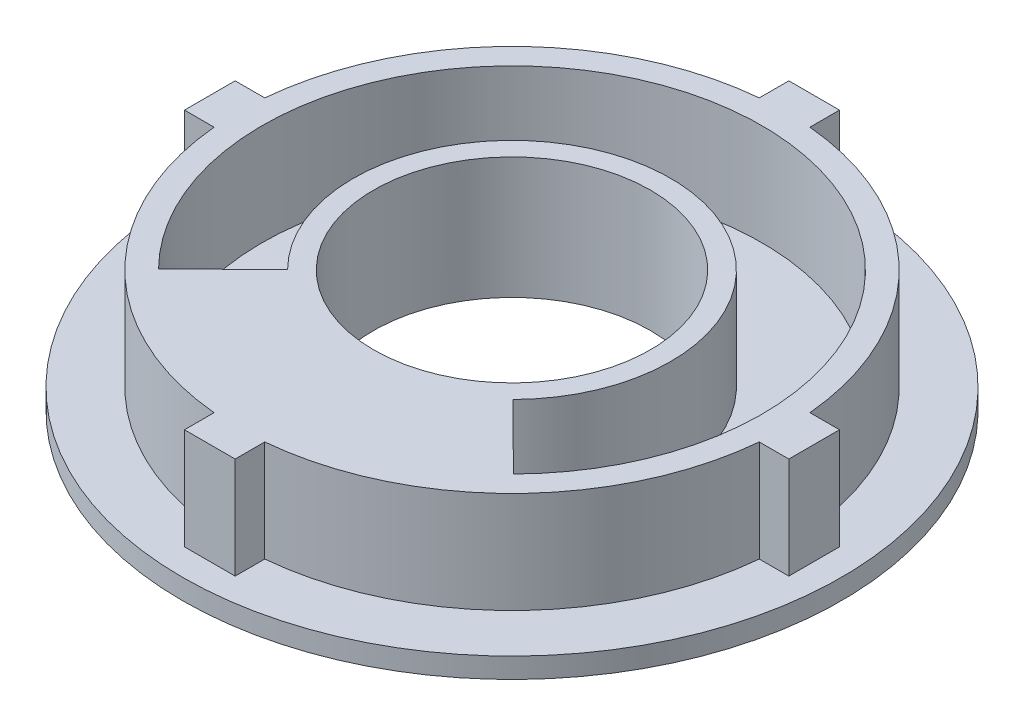
ISO-10303-21;
HEADER;
FILE_DESCRIPTION(('STEP AP214'),'2;1');
FILE_NAME('part.step','',(''),(''),'','','');
FILE_SCHEMA(('AUTOMOTIVE_DESIGN { 1 0 10303 214 1 1 1 1 }'));
ENDSEC;
DATA;
#1=APPLICATION_CONTEXT('core data for automotive mechanical design processes');
#2=APPLICATION_PROTOCOL_DEFINITION('international standard','automotive_design',2000,#1);
#3=PRODUCT_CONTEXT('',#1,'mechanical');
#4=PRODUCT('Part','Part','',(#3));
#5=PRODUCT_RELATED_PRODUCT_CATEGORY('part','',(#4));
#6=PRODUCT_DEFINITION_FORMATION('','',#4);
#7=PRODUCT_DEFINITION_CONTEXT('part definition',#1,'design');
#8=PRODUCT_DEFINITION('design','',#6,#7);
#9=PRODUCT_DEFINITION_SHAPE('','',#8);
#10=(LENGTH_UNIT() NAMED_UNIT(*) SI_UNIT(.MILLI.,.METRE.));
#11=(NAMED_UNIT(*) PLANE_ANGLE_UNIT() SI_UNIT($,.RADIAN.));
#12=(NAMED_UNIT(*) SI_UNIT($,.STERADIAN.) SOLID_ANGLE_UNIT());
#13=UNCERTAINTY_MEASURE_WITH_UNIT(LENGTH_MEASURE(1.E-05),#10,'distance_accuracy_value','');
#14=(GEOMETRIC_REPRESENTATION_CONTEXT(3) GLOBAL_UNCERTAINTY_ASSIGNED_CONTEXT((#13)) GLOBAL_UNIT_ASSIGNED_CONTEXT((#10,
#11,#12)) REPRESENTATION_CONTEXT('',''));
#15=CARTESIAN_POINT('',(0.,0.,0.));
#16=DIRECTION('',(0.,0.,1.));
#17=DIRECTION('',(1.,0.,0.));
#18=AXIS2_PLACEMENT_3D('',#15,#16,#17);
#19=CARTESIAN_POINT('',(0.,10.,0.));
#20=DIRECTION('',(0.,-1.,0.));
#21=DIRECTION('',(0.,0.,-1.));
#22=AXIS2_PLACEMENT_3D('',#19,#20,#21);
#23=CYLINDRICAL_SURFACE('',#22,27.);
#24=DIRECTION('',(0.,-1.,0.));
#25=VECTOR('',#24,1.);
#26=CARTESIAN_POINT('',(-26.8840101175404,10.,-2.49999999999735));
#27=LINE('',#26,#25);
#28=CARTESIAN_POINT('',(-26.8840101175404,10.,-2.49999999999735));
#29=VERTEX_POINT('',#28);
#30=CARTESIAN_POINT('',(-26.8840101175404,0.,-2.49999999999735));
#31=VERTEX_POINT('',#30);
#32=EDGE_CURVE('E216',#29,#31,#27,.T.);
#33=ORIENTED_EDGE('',*,*,#32,.F.);
#34=CARTESIAN_POINT('',(0.,10.,0.));
#35=DIRECTION('',(0.,1.,0.));
#36=DIRECTION('',(0.,0.,1.));
#37=AXIS2_PLACEMENT_3D('',#34,#35,#36);
#38=CIRCLE('',#37,27.);
#39=CARTESIAN_POINT('',(-2.5,10.,-26.8840101175401));
#40=VERTEX_POINT('',#39);
#41=EDGE_CURVE('E47',#40,#29,#38,.T.);
#42=ORIENTED_EDGE('',*,*,#41,.F.);
#43=DIRECTION('',(0.,-1.,0.));
#44=VECTOR('',#43,1.);
#45=CARTESIAN_POINT('',(-2.5,10.,-26.8840101175401));
#46=LINE('',#45,#44);
#47=CARTESIAN_POINT('',(-2.5,0.,-26.8840101175401));
#48=VERTEX_POINT('',#47);
#49=EDGE_CURVE('E320',#48,#40,#46,.F.);
#50=ORIENTED_EDGE('',*,*,#49,.F.);
#51=CARTESIAN_POINT('',(0.,0.,0.));
#52=DIRECTION('',(0.,1.,0.));
#53=DIRECTION('',(0.,0.,1.));
#54=AXIS2_PLACEMENT_3D('',#51,#52,#53);
#55=CIRCLE('',#54,27.);
#56=EDGE_CURVE('E361',#48,#31,#55,.T.);
#57=ORIENTED_EDGE('',*,*,#56,.T.);
#58=EDGE_LOOP('',(#33,#42,#50,#57));
#59=FACE_BOUND('',#58,.T.);
#60=ADVANCED_FACE('F39',(#59),#23,.T.);
#61=DIRECTION('',(0.,-1.,0.));
#62=VECTOR('',#61,1.);
#63=CARTESIAN_POINT('',(-26.8840101175399,10.,2.50000000000265));
#64=LINE('',#63,#62);
#65=CARTESIAN_POINT('',(-26.8840101175399,0.,2.50000000000265));
#66=VERTEX_POINT('',#65);
#67=CARTESIAN_POINT('',(-26.8840101175399,10.,2.50000000000265));
#68=VERTEX_POINT('',#67);
#69=EDGE_CURVE('E193',#66,#68,#64,.F.);
#70=ORIENTED_EDGE('',*,*,#69,.F.);
#71=CARTESIAN_POINT('',(-2.49999999999417,0.,26.8840101175407));
#72=VERTEX_POINT('',#71);
#73=EDGE_CURVE('E393',#66,#72,#55,.T.);
#74=ORIENTED_EDGE('',*,*,#73,.T.);
#75=DIRECTION('',(0.,-1.,0.));
#76=VECTOR('',#75,1.);
#77=CARTESIAN_POINT('',(-2.49999999999417,10.,26.8840101175407));
#78=LINE('',#77,#76);
#79=CARTESIAN_POINT('',(-2.49999999999417,10.,26.8840101175407));
#80=VERTEX_POINT('',#79);
#81=EDGE_CURVE('E253',#80,#72,#78,.T.);
#82=ORIENTED_EDGE('',*,*,#81,.F.);
#83=EDGE_CURVE('E390',#68,#80,#38,.T.);
#84=ORIENTED_EDGE('',*,*,#83,.F.);
#85=EDGE_LOOP('',(#70,#74,#82,#84));
#86=FACE_BOUND('',#85,.T.);
#87=ADVANCED_FACE('F435',(#86),#23,.T.);
#88=CARTESIAN_POINT('',(0.,0.,0.));
#89=DIRECTION('',(0.,-1.,0.));
#90=DIRECTION('',(0.,0.,-1.));
#91=AXIS2_PLACEMENT_3D('',#88,#89,#90);
#92=PLANE('',#91);
#93=CARTESIAN_POINT('',(0.,0.,0.));
#94=DIRECTION('',(0.,-1.,0.));
#95=DIRECTION('',(0.,0.,-1.));
#96=AXIS2_PLACEMENT_3D('',#93,#94,#95);
#97=CIRCLE('',#96,32.5);
#98=CARTESIAN_POINT('',(0.,0.,-32.5));
#99=VERTEX_POINT('',#98);
#100=EDGE_CURVE('E332',#99,#99,#97,.T.);
#101=ORIENTED_EDGE('',*,*,#100,.F.);
#102=EDGE_LOOP('',(#101));
#103=FACE_BOUND('',#102,.T.);
#104=DIRECTION('',(-1.,0.,0.));
#105=VECTOR('',#104,1.);
#106=CARTESIAN_POINT('',(-29.7999999999968,0.,-2.49999999999735));
#107=LINE('',#106,#105);
#108=CARTESIAN_POINT('',(-29.7999999999968,0.,-2.49999999999735));
#109=VERTEX_POINT('',#108);
#110=EDGE_CURVE('E190',#31,#109,#107,.T.);
#111=ORIENTED_EDGE('',*,*,#110,.F.);
#112=ORIENTED_EDGE('',*,*,#56,.F.);
#113=DIRECTION('',(0.,0.,1.));
#114=VECTOR('',#113,1.);
#115=CARTESIAN_POINT('',(-2.5,0.,-29.8));
#116=LINE('',#115,#114);
#117=CARTESIAN_POINT('',(-2.5,0.,-29.8));
#118=VERTEX_POINT('',#117);
#119=EDGE_CURVE('E300',#118,#48,#116,.T.);
#120=ORIENTED_EDGE('',*,*,#119,.F.);
#121=DIRECTION('',(-1.,0.,0.));
#122=VECTOR('',#121,1.);
#123=CARTESIAN_POINT('',(-2.5,0.,-29.8));
#124=LINE('',#123,#122);
#125=CARTESIAN_POINT('',(2.5,0.,-29.8));
#126=VERTEX_POINT('',#125);
#127=EDGE_CURVE('E295',#126,#118,#124,.T.);
#128=ORIENTED_EDGE('',*,*,#127,.F.);
#129=DIRECTION('',(0.,0.,-1.));
#130=VECTOR('',#129,1.);
#131=CARTESIAN_POINT('',(2.5,0.,0.));
#132=LINE('',#131,#130);
#133=CARTESIAN_POINT('',(2.5,0.,-26.8840101175401));
#134=VERTEX_POINT('',#133);
#135=EDGE_CURVE('E11',#134,#126,#132,.T.);
#136=ORIENTED_EDGE('',*,*,#135,.F.);
#137=CARTESIAN_POINT('',(26.8840101175398,0.,-2.50000000000318));
#138=VERTEX_POINT('',#137);
#139=EDGE_CURVE('E337',#138,#134,#55,.T.);
#140=ORIENTED_EDGE('',*,*,#139,.F.);
#141=DIRECTION('',(-1.,0.,0.));
#142=VECTOR('',#141,1.);
#143=CARTESIAN_POINT('',(29.8000000000026,0.,-2.50000000000318));
#144=LINE('',#143,#142);
#145=CARTESIAN_POINT('',(29.8000000000026,0.,-2.50000000000318));
#146=VERTEX_POINT('',#145);
#147=EDGE_CURVE('E262',#146,#138,#144,.T.);
#148=ORIENTED_EDGE('',*,*,#147,.F.);
#149=DIRECTION('',(0.,0.,-1.));
#150=VECTOR('',#149,1.);
#151=CARTESIAN_POINT('',(29.8000000000026,0.,-2.50000000000318));
#152=LINE('',#151,#150);
#153=CARTESIAN_POINT('',(29.8000000000026,0.,2.49999999999682));
#154=VERTEX_POINT('',#153);
#155=EDGE_CURVE('E273',#154,#146,#152,.T.);
#156=ORIENTED_EDGE('',*,*,#155,.F.);
#157=DIRECTION('',(1.,0.,0.));
#158=VECTOR('',#157,1.);
#159=CARTESIAN_POINT('',(29.8000000000026,0.,2.49999999999682));
#160=LINE('',#159,#158);
#161=CARTESIAN_POINT('',(26.8840101175404,0.,2.49999999999682));
#162=VERTEX_POINT('',#161);
#163=EDGE_CURVE('E257',#162,#154,#160,.T.);
#164=ORIENTED_EDGE('',*,*,#163,.F.);
#165=CARTESIAN_POINT('',(2.50000000000583,0.,26.8840101175396));
#166=VERTEX_POINT('',#165);
#167=EDGE_CURVE('E397',#166,#162,#55,.T.);
#168=ORIENTED_EDGE('',*,*,#167,.F.);
#169=DIRECTION('',(0.,0.,-1.));
#170=VECTOR('',#169,1.);
#171=CARTESIAN_POINT('',(2.50000000000583,0.,29.7999999999995));
#172=LINE('',#171,#170);
#173=CARTESIAN_POINT('',(2.50000000000583,0.,29.7999999999995));
#174=VERTEX_POINT('',#173);
#175=EDGE_CURVE('E224',#174,#166,#172,.T.);
#176=ORIENTED_EDGE('',*,*,#175,.F.);
#177=DIRECTION('',(1.,0.,0.));
#178=VECTOR('',#177,1.);
#179=CARTESIAN_POINT('',(2.50000000000583,0.,29.7999999999995));
#180=LINE('',#179,#178);
#181=CARTESIAN_POINT('',(-2.49999999999417,0.,29.7999999999995));
#182=VERTEX_POINT('',#181);
#183=EDGE_CURVE('E235',#182,#174,#180,.T.);
#184=ORIENTED_EDGE('',*,*,#183,.F.);
#185=DIRECTION('',(0.,0.,1.));
#186=VECTOR('',#185,1.);
#187=CARTESIAN_POINT('',(-2.49999999999417,0.,29.7999999999995));
#188=LINE('',#187,#186);
#189=EDGE_CURVE('E219',#72,#182,#188,.T.);
#190=ORIENTED_EDGE('',*,*,#189,.F.);
#191=ORIENTED_EDGE('',*,*,#73,.F.);
#192=DIRECTION('',(1.,0.,0.));
#193=VECTOR('',#192,1.);
#194=CARTESIAN_POINT('',(-29.7999999999968,0.,2.50000000000265));
#195=LINE('',#194,#193);
#196=CARTESIAN_POINT('',(-29.7999999999968,0.,2.50000000000265));
#197=VERTEX_POINT('',#196);
#198=EDGE_CURVE('E59',#197,#66,#195,.T.);
#199=ORIENTED_EDGE('',*,*,#198,.F.);
#200=DIRECTION('',(0.,0.,1.));
#201=VECTOR('',#200,1.);
#202=CARTESIAN_POINT('',(-29.7999999999968,0.,2.50000000000265));
#203=LINE('',#202,#201);
#204=EDGE_CURVE('E54',#109,#197,#203,.T.);
#205=ORIENTED_EDGE('',*,*,#204,.F.);
#206=EDGE_LOOP('',(#111,#112,#120,#128,#136,#140,#148,#156,#164,#168,#176,#184,#190,#191,#199,#205));
#207=FACE_BOUND('',#206,.T.);
#208=ADVANCED_FACE('F410',(#103,#207),#92,.F.);
#209=DIRECTION('',(0.,-1.,0.));
#210=VECTOR('',#209,1.);
#211=CARTESIAN_POINT('',(2.50000000000583,10.,26.8840101175396));
#212=LINE('',#211,#210);
#213=CARTESIAN_POINT('',(2.50000000000583,10.,26.8840101175396));
#214=VERTEX_POINT('',#213);
#215=EDGE_CURVE('E249',#166,#214,#212,.F.);
#216=ORIENTED_EDGE('',*,*,#215,.F.);
#217=ORIENTED_EDGE('',*,*,#167,.T.);
#218=DIRECTION('',(0.,-1.,0.));
#219=VECTOR('',#218,1.);
#220=CARTESIAN_POINT('',(26.8840101175404,10.,2.49999999999682));
#221=LINE('',#220,#219);
#222=CARTESIAN_POINT('',(26.8840101175404,10.,2.49999999999682));
#223=VERTEX_POINT('',#222);
#224=EDGE_CURVE('E291',#223,#162,#221,.T.);
#225=ORIENTED_EDGE('',*,*,#224,.F.);
#226=EDGE_CURVE('E416',#214,#223,#38,.T.);
#227=ORIENTED_EDGE('',*,*,#226,.F.);
#228=EDGE_LOOP('',(#216,#217,#225,#227));
#229=FACE_BOUND('',#228,.T.);
#230=ADVANCED_FACE('F408',(#229),#23,.T.);
#231=DIRECTION('',(0.,-1.,0.));
#232=VECTOR('',#231,1.);
#233=CARTESIAN_POINT('',(26.8840101175398,10.,-2.50000000000318));
#234=LINE('',#233,#232);
#235=CARTESIAN_POINT('',(26.8840101175398,10.,-2.50000000000318));
#236=VERTEX_POINT('',#235);
#237=EDGE_CURVE('E287',#138,#236,#234,.F.);
#238=ORIENTED_EDGE('',*,*,#237,.F.);
#239=ORIENTED_EDGE('',*,*,#139,.T.);
#240=DIRECTION('',(0.,-1.,0.));
#241=VECTOR('',#240,1.);
#242=CARTESIAN_POINT('',(2.5,10.,-26.8840101175401));
#243=LINE('',#242,#241);
#244=CARTESIAN_POINT('',(2.5,10.,-26.8840101175401));
#245=VERTEX_POINT('',#244);
#246=EDGE_CURVE('E324',#245,#134,#243,.T.);
#247=ORIENTED_EDGE('',*,*,#246,.F.);
#248=EDGE_CURVE('E388',#236,#245,#38,.T.);
#249=ORIENTED_EDGE('',*,*,#248,.F.);
#250=EDGE_LOOP('',(#238,#239,#247,#249));
#251=FACE_BOUND('',#250,.T.);
#252=ADVANCED_FACE('F424',(#251),#23,.T.);
#253=CARTESIAN_POINT('',(0.,10.,0.));
#254=DIRECTION('',(0.,1.,0.));
#255=DIRECTION('',(0.,0.,1.));
#256=AXIS2_PLACEMENT_3D('',#253,#254,#255);
#257=PLANE('',#256);
#258=ORIENTED_EDGE('',*,*,#41,.T.);
#259=DIRECTION('',(-1.,0.,0.));
#260=VECTOR('',#259,1.);
#261=CARTESIAN_POINT('',(-29.7999999999968,10.,-2.49999999999735));
#262=LINE('',#261,#260);
#263=CARTESIAN_POINT('',(-29.7999999999968,10.,-2.49999999999735));
#264=VERTEX_POINT('',#263);
#265=EDGE_CURVE('E174',#29,#264,#262,.T.);
#266=ORIENTED_EDGE('',*,*,#265,.T.);
#267=DIRECTION('',(0.,0.,1.));
#268=VECTOR('',#267,1.);
#269=CARTESIAN_POINT('',(-29.7999999999968,10.,2.50000000000265));
#270=LINE('',#269,#268);
#271=CARTESIAN_POINT('',(-29.7999999999968,10.,2.50000000000265));
#272=VERTEX_POINT('',#271);
#273=EDGE_CURVE('E180',#264,#272,#270,.T.);
#274=ORIENTED_EDGE('',*,*,#273,.T.);
#275=DIRECTION('',(1.,0.,0.));
#276=VECTOR('',#275,1.);
#277=CARTESIAN_POINT('',(-29.7999999999968,10.,2.50000000000265));
#278=LINE('',#277,#276);
#279=EDGE_CURVE('E200',#272,#68,#278,.T.);
#280=ORIENTED_EDGE('',*,*,#279,.T.);
#281=ORIENTED_EDGE('',*,*,#83,.T.);
#282=DIRECTION('',(0.,0.,1.));
#283=VECTOR('',#282,1.);
#284=CARTESIAN_POINT('',(-2.49999999999417,10.,29.7999999999995));
#285=LINE('',#284,#283);
#286=CARTESIAN_POINT('',(-2.49999999999417,10.,29.7999999999995));
#287=VERTEX_POINT('',#286);
#288=EDGE_CURVE('E220',#80,#287,#285,.T.);
#289=ORIENTED_EDGE('',*,*,#288,.T.);
#290=DIRECTION('',(1.,0.,0.));
#291=VECTOR('',#290,1.);
#292=CARTESIAN_POINT('',(2.50000000000583,10.,29.7999999999995));
#293=LINE('',#292,#291);
#294=CARTESIAN_POINT('',(2.50000000000583,10.,29.7999999999995));
#295=VERTEX_POINT('',#294);
#296=EDGE_CURVE('E223',#287,#295,#293,.T.);
#297=ORIENTED_EDGE('',*,*,#296,.T.);
#298=DIRECTION('',(0.,0.,-1.));
#299=VECTOR('',#298,1.);
#300=CARTESIAN_POINT('',(2.50000000000583,10.,29.7999999999995));
#301=LINE('',#300,#299);
#302=EDGE_CURVE('E227',#295,#214,#301,.T.);
#303=ORIENTED_EDGE('',*,*,#302,.T.);
#304=ORIENTED_EDGE('',*,*,#226,.T.);
#305=DIRECTION('',(1.,0.,0.));
#306=VECTOR('',#305,1.);
#307=CARTESIAN_POINT('',(29.8000000000026,10.,2.49999999999682));
#308=LINE('',#307,#306);
#309=CARTESIAN_POINT('',(29.8000000000026,10.,2.49999999999682));
#310=VERTEX_POINT('',#309);
#311=EDGE_CURVE('E258',#223,#310,#308,.T.);
#312=ORIENTED_EDGE('',*,*,#311,.T.);
#313=DIRECTION('',(0.,0.,-1.));
#314=VECTOR('',#313,1.);
#315=CARTESIAN_POINT('',(29.8000000000026,10.,-2.50000000000318));
#316=LINE('',#315,#314);
#317=CARTESIAN_POINT('',(29.8000000000026,10.,-2.50000000000318));
#318=VERTEX_POINT('',#317);
#319=EDGE_CURVE('E261',#310,#318,#316,.T.);
#320=ORIENTED_EDGE('',*,*,#319,.T.);
#321=DIRECTION('',(-1.,0.,0.));
#322=VECTOR('',#321,1.);
#323=CARTESIAN_POINT('',(29.8000000000026,10.,-2.50000000000318));
#324=LINE('',#323,#322);
#325=EDGE_CURVE('E265',#318,#236,#324,.T.);
#326=ORIENTED_EDGE('',*,*,#325,.T.);
#327=ORIENTED_EDGE('',*,*,#248,.T.);
#328=DIRECTION('',(0.,0.,-1.));
#329=VECTOR('',#328,1.);
#330=CARTESIAN_POINT('',(2.5,10.,-29.8));
#331=LINE('',#330,#329);
#332=CARTESIAN_POINT('',(2.5,10.,-29.8));
#333=VERTEX_POINT('',#332);
#334=EDGE_CURVE('E296',#245,#333,#331,.T.);
#335=ORIENTED_EDGE('',*,*,#334,.T.);
#336=DIRECTION('',(-1.,0.,0.));
#337=VECTOR('',#336,1.);
#338=CARTESIAN_POINT('',(-2.5,10.,-29.8));
#339=LINE('',#338,#337);
#340=CARTESIAN_POINT('',(-2.5,10.,-29.8));
#341=VERTEX_POINT('',#340);
#342=EDGE_CURVE('E299',#333,#341,#339,.T.);
#343=ORIENTED_EDGE('',*,*,#342,.T.);
#344=DIRECTION('',(0.,0.,1.));
#345=VECTOR('',#344,1.);
#346=CARTESIAN_POINT('',(-2.5,10.,-29.8));
#347=LINE('',#346,#345);
#348=EDGE_CURVE('E303',#341,#40,#347,.T.);
#349=ORIENTED_EDGE('',*,*,#348,.T.);
#350=EDGE_LOOP('',(#258,#266,#274,#280,#281,#289,#297,#303,#304,#312,#320,#326,#327,#335,#343,#349));
#351=FACE_BOUND('',#350,.T.);
#352=CARTESIAN_POINT('',(0.,10.,0.));
#353=DIRECTION('',(0.,1.,0.));
#354=DIRECTION('',(0.,0.,1.));
#355=AXIS2_PLACEMENT_3D('',#352,#353,#354);
#356=CIRCLE('',#355,13.65);
#357=CARTESIAN_POINT('',(0.,10.,13.65));
#358=VERTEX_POINT('',#357);
#359=EDGE_CURVE('E384',#358,#358,#356,.T.);
#360=ORIENTED_EDGE('',*,*,#359,.F.);
#361=EDGE_LOOP('',(#360));
#362=FACE_BOUND('',#361,.T.);
#363=DIRECTION('',(0.709939148073022,0.,-0.704263023332441));
#364=VECTOR('',#363,1.);
#365=CARTESIAN_POINT('',(-17.5,10.,17.3600835251447));
#366=LINE('',#365,#364);
#367=CARTESIAN_POINT('',(-17.5,10.,17.3600835251447));
#368=VERTEX_POINT('',#367);
#369=CARTESIAN_POINT('',(-11.1105476673428,10.,11.0217163151527));
#370=VERTEX_POINT('',#369);
#371=EDGE_CURVE('E344',#368,#370,#366,.T.);
#372=ORIENTED_EDGE('',*,*,#371,.F.);
#373=CARTESIAN_POINT('',(0.,10.,0.));
#374=DIRECTION('',(0.,1.,0.));
#375=DIRECTION('',(0.,0.,1.));
#376=AXIS2_PLACEMENT_3D('',#373,#374,#375);
#377=CIRCLE('',#376,24.65);
#378=CARTESIAN_POINT('',(17.5,10.,17.3600835251447));
#379=VERTEX_POINT('',#378);
#380=EDGE_CURVE('E341',#379,#368,#377,.T.);
#381=ORIENTED_EDGE('',*,*,#380,.F.);
#382=DIRECTION('',(0.709939148073022,0.,0.704263023332441));
#383=VECTOR('',#382,1.);
#384=CARTESIAN_POINT('',(17.5,10.,17.3600835251447));
#385=LINE('',#384,#383);
#386=CARTESIAN_POINT('',(11.1105476673428,10.,11.0217163151527));
#387=VERTEX_POINT('',#386);
#388=EDGE_CURVE('E352',#387,#379,#385,.T.);
#389=ORIENTED_EDGE('',*,*,#388,.F.);
#390=CARTESIAN_POINT('',(0.,10.,0.));
#391=DIRECTION('',(0.,-1.,0.));
#392=DIRECTION('',(0.,0.,1.));
#393=AXIS2_PLACEMENT_3D('',#390,#391,#392);
#394=CIRCLE('',#393,15.65);
#395=EDGE_CURVE('E348',#370,#387,#394,.T.);
#396=ORIENTED_EDGE('',*,*,#395,.F.);
#397=EDGE_LOOP('',(#372,#381,#389,#396));
#398=FACE_BOUND('',#397,.T.);
#399=ADVANCED_FACE('F176',(#351,#362,#398),#257,.T.);
#400=CARTESIAN_POINT('',(0.,10.,0.));
#401=DIRECTION('',(0.,-1.,0.));
#402=DIRECTION('',(0.,0.,-1.));
#403=AXIS2_PLACEMENT_3D('',#400,#401,#402);
#404=CYLINDRICAL_SURFACE('',#403,13.65);
#405=ORIENTED_EDGE('',*,*,#359,.T.);
#406=EDGE_LOOP('',(#405));
#407=FACE_BOUND('',#406,.T.);
#408=CARTESIAN_POINT('',(0.,-2.,0.));
#409=DIRECTION('',(0.,-1.,0.));
#410=DIRECTION('',(0.,0.,-1.));
#411=AXIS2_PLACEMENT_3D('',#408,#409,#410);
#412=CIRCLE('',#411,13.65);
#413=CARTESIAN_POINT('',(0.,-2.,-13.65));
#414=VERTEX_POINT('',#413);
#415=EDGE_CURVE('E328',#414,#414,#412,.T.);
#416=ORIENTED_EDGE('',*,*,#415,.T.);
#417=EDGE_LOOP('',(#416));
#418=FACE_BOUND('',#417,.T.);
#419=ADVANCED_FACE('F445',(#407,#418),#404,.F.);
#420=CARTESIAN_POINT('',(0.,10.,0.));
#421=DIRECTION('',(0.,-1.,0.));
#422=DIRECTION('',(0.,0.,-1.));
#423=AXIS2_PLACEMENT_3D('',#420,#421,#422);
#424=CYLINDRICAL_SURFACE('',#423,24.65);
#425=CARTESIAN_POINT('',(0.,0.,0.));
#426=DIRECTION('',(0.,1.,0.));
#427=DIRECTION('',(0.,0.,1.));
#428=AXIS2_PLACEMENT_3D('',#425,#426,#427);
#429=CIRCLE('',#428,24.65);
#430=CARTESIAN_POINT('',(17.5,0.,17.3600835251447));
#431=VERTEX_POINT('',#430);
#432=CARTESIAN_POINT('',(-17.5,0.,17.3600835251447));
#433=VERTEX_POINT('',#432);
#434=EDGE_CURVE('E356',#431,#433,#429,.T.);
#435=ORIENTED_EDGE('',*,*,#434,.F.);
#436=DIRECTION('',(0.,-1.,0.));
#437=VECTOR('',#436,1.);
#438=CARTESIAN_POINT('',(17.5,10.,17.3600835251447));
#439=LINE('',#438,#437);
#440=EDGE_CURVE('E355',#379,#431,#439,.T.);
#441=ORIENTED_EDGE('',*,*,#440,.F.);
#442=ORIENTED_EDGE('',*,*,#380,.T.);
#443=DIRECTION('',(0.,-1.,0.));
#444=VECTOR('',#443,1.);
#445=CARTESIAN_POINT('',(-17.5,10.,17.3600835251447));
#446=LINE('',#445,#444);
#447=EDGE_CURVE('E380',#368,#433,#446,.T.);
#448=ORIENTED_EDGE('',*,*,#447,.T.);
#449=EDGE_LOOP('',(#435,#441,#442,#448));
#450=FACE_BOUND('',#449,.T.);
#451=ADVANCED_FACE('F477',(#450),#424,.F.);
#452=CARTESIAN_POINT('',(-17.5,10.,17.3600835251447));
#453=DIRECTION('',(-0.704263023332442,0.,-0.709939148073022));
#454=DIRECTION('',(-0.709939148073022,0.,0.704263023332442));
#455=AXIS2_PLACEMENT_3D('',#452,#453,#454);
#456=PLANE('',#455);
#457=DIRECTION('',(0.709939148073022,0.,-0.704263023332441));
#458=VECTOR('',#457,1.);
#459=CARTESIAN_POINT('',(-17.5,0.,17.3600835251447));
#460=LINE('',#459,#458);
#461=CARTESIAN_POINT('',(-11.1105476673428,0.,11.0217163151527));
#462=VERTEX_POINT('',#461);
#463=EDGE_CURVE('E360',#433,#462,#460,.T.);
#464=ORIENTED_EDGE('',*,*,#463,.F.);
#465=ORIENTED_EDGE('',*,*,#447,.F.);
#466=ORIENTED_EDGE('',*,*,#371,.T.);
#467=DIRECTION('',(0.,-1.,0.));
#468=VECTOR('',#467,1.);
#469=CARTESIAN_POINT('',(-11.1105476673428,10.,11.0217163151527));
#470=LINE('',#469,#468);
#471=EDGE_CURVE('E377',#370,#462,#470,.T.);
#472=ORIENTED_EDGE('',*,*,#471,.T.);
#473=EDGE_LOOP('',(#464,#465,#466,#472));
#474=FACE_BOUND('',#473,.T.);
#475=ADVANCED_FACE('F481',(#474),#456,.T.);
#476=CARTESIAN_POINT('',(0.,10.,0.));
#477=DIRECTION('',(0.,-1.,0.));
#478=DIRECTION('',(0.,0.,-1.));
#479=AXIS2_PLACEMENT_3D('',#476,#477,#478);
#480=CYLINDRICAL_SURFACE('',#479,15.65);
#481=CARTESIAN_POINT('',(0.,0.,0.));
#482=DIRECTION('',(0.,-1.,0.));
#483=DIRECTION('',(0.,0.,1.));
#484=AXIS2_PLACEMENT_3D('',#481,#482,#483);
#485=CIRCLE('',#484,15.65);
#486=CARTESIAN_POINT('',(11.1105476673428,0.,11.0217163151527));
#487=VERTEX_POINT('',#486);
#488=EDGE_CURVE('E365',#462,#487,#485,.T.);
#489=ORIENTED_EDGE('',*,*,#488,.F.);
#490=ORIENTED_EDGE('',*,*,#471,.F.);
#491=ORIENTED_EDGE('',*,*,#395,.T.);
#492=DIRECTION('',(0.,-1.,0.));
#493=VECTOR('',#492,1.);
#494=CARTESIAN_POINT('',(11.1105476673428,10.,11.0217163151527));
#495=LINE('',#494,#493);
#496=EDGE_CURVE('E374',#387,#487,#495,.T.);
#497=ORIENTED_EDGE('',*,*,#496,.T.);
#498=EDGE_LOOP('',(#489,#490,#491,#497));
#499=FACE_BOUND('',#498,.T.);
#500=ADVANCED_FACE('F467',(#499),#480,.T.);
#501=CARTESIAN_POINT('',(17.5,10.,17.3600835251447));
#502=DIRECTION('',(0.704263023332442,0.,-0.709939148073022));
#503=DIRECTION('',(-0.709939148073022,0.,-0.704263023332442));
#504=AXIS2_PLACEMENT_3D('',#501,#502,#503);
#505=PLANE('',#504);
#506=DIRECTION('',(0.709939148073022,0.,0.704263023332441));
#507=VECTOR('',#506,1.);
#508=CARTESIAN_POINT('',(17.5,0.,17.3600835251447));
#509=LINE('',#508,#507);
#510=EDGE_CURVE('E345',#487,#431,#509,.T.);
#511=ORIENTED_EDGE('',*,*,#510,.F.);
#512=ORIENTED_EDGE('',*,*,#496,.F.);
#513=ORIENTED_EDGE('',*,*,#388,.T.);
#514=ORIENTED_EDGE('',*,*,#440,.T.);
#515=EDGE_LOOP('',(#511,#512,#513,#514));
#516=FACE_BOUND('',#515,.T.);
#517=ADVANCED_FACE('F459',(#516),#505,.T.);
#518=ORIENTED_EDGE('',*,*,#510,.T.);
#519=ORIENTED_EDGE('',*,*,#434,.T.);
#520=ORIENTED_EDGE('',*,*,#463,.T.);
#521=ORIENTED_EDGE('',*,*,#488,.T.);
#522=EDGE_LOOP('',(#518,#519,#520,#521));
#523=FACE_BOUND('',#522,.T.);
#524=ADVANCED_FACE('F451',(#523),#92,.F.);
#525=CARTESIAN_POINT('',(0.,-2.,0.));
#526=DIRECTION('',(0.,-1.,0.));
#527=DIRECTION('',(0.,0.,-1.));
#528=AXIS2_PLACEMENT_3D('',#525,#526,#527);
#529=PLANE('',#528);
#530=CARTESIAN_POINT('',(0.,-2.,0.));
#531=DIRECTION('',(0.,-1.,0.));
#532=DIRECTION('',(0.,0.,-1.));
#533=AXIS2_PLACEMENT_3D('',#530,#531,#532);
#534=CIRCLE('',#533,32.5);
#535=CARTESIAN_POINT('',(0.,-2.,-32.5));
#536=VERTEX_POINT('',#535);
#537=EDGE_CURVE('E333',#536,#536,#534,.T.);
#538=ORIENTED_EDGE('',*,*,#537,.T.);
#539=EDGE_LOOP('',(#538));
#540=FACE_BOUND('',#539,.T.);
#541=ORIENTED_EDGE('',*,*,#415,.F.);
#542=EDGE_LOOP('',(#541));
#543=FACE_BOUND('',#542,.T.);
#544=ADVANCED_FACE('F458',(#540,#543),#529,.T.);
#545=CARTESIAN_POINT('',(0.,-2.,0.));
#546=DIRECTION('',(0.,1.,0.));
#547=DIRECTION('',(0.,0.,1.));
#548=AXIS2_PLACEMENT_3D('',#545,#546,#547);
#549=CYLINDRICAL_SURFACE('',#548,32.5);
#550=ORIENTED_EDGE('',*,*,#537,.F.);
#551=EDGE_LOOP('',(#550));
#552=FACE_BOUND('',#551,.T.);
#553=ORIENTED_EDGE('',*,*,#100,.T.);
#554=EDGE_LOOP('',(#553));
#555=FACE_BOUND('',#554,.T.);
#556=ADVANCED_FACE('F465',(#552,#555),#549,.T.);
#557=CARTESIAN_POINT('',(2.5,10.,-29.8));
#558=DIRECTION('',(-1.,0.,0.));
#559=DIRECTION('',(0.,0.,1.));
#560=AXIS2_PLACEMENT_3D('',#557,#558,#559);
#561=PLANE('',#560);
#562=ORIENTED_EDGE('',*,*,#334,.F.);
#563=ORIENTED_EDGE('',*,*,#246,.T.);
#564=ORIENTED_EDGE('',*,*,#135,.T.);
#565=DIRECTION('',(0.,-1.,0.));
#566=VECTOR('',#565,1.);
#567=CARTESIAN_POINT('',(2.5,10.,-29.8));
#568=LINE('',#567,#566);
#569=EDGE_CURVE('E316',#333,#126,#568,.T.);
#570=ORIENTED_EDGE('',*,*,#569,.F.);
#571=EDGE_LOOP('',(#562,#563,#564,#570));
#572=FACE_BOUND('',#571,.T.);
#573=ADVANCED_FACE('F427',(#572),#561,.F.);
#574=CARTESIAN_POINT('',(-2.5,10.,-29.8));
#575=DIRECTION('',(1.,0.,0.));
#576=DIRECTION('',(0.,0.,-1.));
#577=AXIS2_PLACEMENT_3D('',#574,#575,#576);
#578=PLANE('',#577);
#579=ORIENTED_EDGE('',*,*,#119,.T.);
#580=ORIENTED_EDGE('',*,*,#49,.T.);
#581=ORIENTED_EDGE('',*,*,#348,.F.);
#582=DIRECTION('',(0.,-1.,0.));
#583=VECTOR('',#582,1.);
#584=CARTESIAN_POINT('',(-2.5,10.,-29.8));
#585=LINE('',#584,#583);
#586=EDGE_CURVE('E306',#341,#118,#585,.T.);
#587=ORIENTED_EDGE('',*,*,#586,.T.);
#588=EDGE_LOOP('',(#579,#580,#581,#587));
#589=FACE_BOUND('',#588,.T.);
#590=ADVANCED_FACE('F433',(#589),#578,.F.);
#591=CARTESIAN_POINT('',(-2.5,10.,-29.8));
#592=DIRECTION('',(0.,0.,1.));
#593=DIRECTION('',(1.,0.,0.));
#594=AXIS2_PLACEMENT_3D('',#591,#592,#593);
#595=PLANE('',#594);
#596=ORIENTED_EDGE('',*,*,#127,.T.);
#597=ORIENTED_EDGE('',*,*,#586,.F.);
#598=ORIENTED_EDGE('',*,*,#342,.F.);
#599=ORIENTED_EDGE('',*,*,#569,.T.);
#600=EDGE_LOOP('',(#596,#597,#598,#599));
#601=FACE_BOUND('',#600,.T.);
#602=ADVANCED_FACE('F429',(#601),#595,.F.);
#603=CARTESIAN_POINT('',(29.8000000000026,10.,2.49999999999682));
#604=DIRECTION('',(0.,0.,-1.));
#605=DIRECTION('',(-1.,0.,0.));
#606=AXIS2_PLACEMENT_3D('',#603,#604,#605);
#607=PLANE('',#606);
#608=ORIENTED_EDGE('',*,*,#311,.F.);
#609=ORIENTED_EDGE('',*,*,#224,.T.);
#610=ORIENTED_EDGE('',*,*,#163,.T.);
#611=DIRECTION('',(0.,-1.,0.));
#612=VECTOR('',#611,1.);
#613=CARTESIAN_POINT('',(29.8000000000026,10.,2.49999999999682));
#614=LINE('',#613,#612);
#615=EDGE_CURVE('E283',#310,#154,#614,.T.);
#616=ORIENTED_EDGE('',*,*,#615,.F.);
#617=EDGE_LOOP('',(#608,#609,#610,#616));
#618=FACE_BOUND('',#617,.T.);
#619=ADVANCED_FACE('F413',(#618),#607,.F.);
#620=CARTESIAN_POINT('',(29.8000000000026,10.,-2.50000000000318));
#621=DIRECTION('',(0.,0.,1.));
#622=DIRECTION('',(1.,0.,0.));
#623=AXIS2_PLACEMENT_3D('',#620,#621,#622);
#624=PLANE('',#623);
#625=ORIENTED_EDGE('',*,*,#147,.T.);
#626=ORIENTED_EDGE('',*,*,#237,.T.);
#627=ORIENTED_EDGE('',*,*,#325,.F.);
#628=DIRECTION('',(0.,-1.,0.));
#629=VECTOR('',#628,1.);
#630=CARTESIAN_POINT('',(29.8000000000026,10.,-2.50000000000318));
#631=LINE('',#630,#629);
#632=EDGE_CURVE('E269',#318,#146,#631,.T.);
#633=ORIENTED_EDGE('',*,*,#632,.T.);
#634=EDGE_LOOP('',(#625,#626,#627,#633));
#635=FACE_BOUND('',#634,.T.);
#636=ADVANCED_FACE('F602',(#635),#624,.F.);
#637=CARTESIAN_POINT('',(29.8000000000026,10.,-2.50000000000318));
#638=DIRECTION('',(-1.,0.,0.));
#639=DIRECTION('',(0.,0.,1.));
#640=AXIS2_PLACEMENT_3D('',#637,#638,#639);
#641=PLANE('',#640);
#642=ORIENTED_EDGE('',*,*,#155,.T.);
#643=ORIENTED_EDGE('',*,*,#632,.F.);
#644=ORIENTED_EDGE('',*,*,#319,.F.);
#645=ORIENTED_EDGE('',*,*,#615,.T.);
#646=EDGE_LOOP('',(#642,#643,#644,#645));
#647=FACE_BOUND('',#646,.T.);
#648=ADVANCED_FACE('F611',(#647),#641,.F.);
#649=CARTESIAN_POINT('',(-2.49999999999417,10.,29.7999999999995));
#650=DIRECTION('',(1.,0.,0.));
#651=DIRECTION('',(0.,0.,-1.));
#652=AXIS2_PLACEMENT_3D('',#649,#650,#651);
#653=PLANE('',#652);
#654=ORIENTED_EDGE('',*,*,#288,.F.);
#655=ORIENTED_EDGE('',*,*,#81,.T.);
#656=ORIENTED_EDGE('',*,*,#189,.T.);
#657=DIRECTION('',(0.,-1.,0.));
#658=VECTOR('',#657,1.);
#659=CARTESIAN_POINT('',(-2.49999999999417,10.,29.7999999999995));
#660=LINE('',#659,#658);
#661=EDGE_CURVE('E245',#287,#182,#660,.T.);
#662=ORIENTED_EDGE('',*,*,#661,.F.);
#663=EDGE_LOOP('',(#654,#655,#656,#662));
#664=FACE_BOUND('',#663,.T.);
#665=ADVANCED_FACE('F621',(#664),#653,.F.);
#666=CARTESIAN_POINT('',(2.50000000000583,10.,29.7999999999995));
#667=DIRECTION('',(-1.,0.,0.));
#668=DIRECTION('',(0.,0.,1.));
#669=AXIS2_PLACEMENT_3D('',#666,#667,#668);
#670=PLANE('',#669);
#671=ORIENTED_EDGE('',*,*,#175,.T.);
#672=ORIENTED_EDGE('',*,*,#215,.T.);
#673=ORIENTED_EDGE('',*,*,#302,.F.);
#674=DIRECTION('',(0.,-1.,0.));
#675=VECTOR('',#674,1.);
#676=CARTESIAN_POINT('',(2.50000000000583,10.,29.7999999999995));
#677=LINE('',#676,#675);
#678=EDGE_CURVE('E231',#295,#174,#677,.T.);
#679=ORIENTED_EDGE('',*,*,#678,.T.);
#680=EDGE_LOOP('',(#671,#672,#673,#679));
#681=FACE_BOUND('',#680,.T.);
#682=ADVANCED_FACE('F631',(#681),#670,.F.);
#683=CARTESIAN_POINT('',(2.50000000000583,10.,29.7999999999995));
#684=DIRECTION('',(0.,0.,-1.));
#685=DIRECTION('',(-1.,0.,0.));
#686=AXIS2_PLACEMENT_3D('',#683,#684,#685);
#687=PLANE('',#686);
#688=ORIENTED_EDGE('',*,*,#183,.T.);
#689=ORIENTED_EDGE('',*,*,#678,.F.);
#690=ORIENTED_EDGE('',*,*,#296,.F.);
#691=ORIENTED_EDGE('',*,*,#661,.T.);
#692=EDGE_LOOP('',(#688,#689,#690,#691));
#693=FACE_BOUND('',#692,.T.);
#694=ADVANCED_FACE('F641',(#693),#687,.F.);
#695=CARTESIAN_POINT('',(-29.7999999999968,10.,-2.49999999999735));
#696=DIRECTION('',(0.,0.,1.));
#697=DIRECTION('',(1.,0.,0.));
#698=AXIS2_PLACEMENT_3D('',#695,#696,#697);
#699=PLANE('',#698);
#700=ORIENTED_EDGE('',*,*,#265,.F.);
#701=ORIENTED_EDGE('',*,*,#32,.T.);
#702=ORIENTED_EDGE('',*,*,#110,.T.);
#703=DIRECTION('',(0.,-1.,0.));
#704=VECTOR('',#703,1.);
#705=CARTESIAN_POINT('',(-29.7999999999968,10.,-2.49999999999735));
#706=LINE('',#705,#704);
#707=EDGE_CURVE('E188',#264,#109,#706,.T.);
#708=ORIENTED_EDGE('',*,*,#707,.F.);
#709=EDGE_LOOP('',(#700,#701,#702,#708));
#710=FACE_BOUND('',#709,.T.);
#711=ADVANCED_FACE('F189',(#710),#699,.F.);
#712=CARTESIAN_POINT('',(-29.7999999999968,10.,2.50000000000265));
#713=DIRECTION('',(0.,0.,-1.));
#714=DIRECTION('',(-1.,0.,0.));
#715=AXIS2_PLACEMENT_3D('',#712,#713,#714);
#716=PLANE('',#715);
#717=ORIENTED_EDGE('',*,*,#198,.T.);
#718=ORIENTED_EDGE('',*,*,#69,.T.);
#719=ORIENTED_EDGE('',*,*,#279,.F.);
#720=DIRECTION('',(0.,-1.,0.));
#721=VECTOR('',#720,1.);
#722=CARTESIAN_POINT('',(-29.7999999999968,10.,2.50000000000265));
#723=LINE('',#722,#721);
#724=EDGE_CURVE('E194',#272,#197,#723,.T.);
#725=ORIENTED_EDGE('',*,*,#724,.T.);
#726=EDGE_LOOP('',(#717,#718,#719,#725));
#727=FACE_BOUND('',#726,.T.);
#728=ADVANCED_FACE('F660',(#727),#716,.F.);
#729=CARTESIAN_POINT('',(-29.7999999999968,10.,2.50000000000265));
#730=DIRECTION('',(1.,0.,0.));
#731=DIRECTION('',(0.,0.,-1.));
#732=AXIS2_PLACEMENT_3D('',#729,#730,#731);
#733=PLANE('',#732);
#734=ORIENTED_EDGE('',*,*,#204,.T.);
#735=ORIENTED_EDGE('',*,*,#724,.F.);
#736=ORIENTED_EDGE('',*,*,#273,.F.);
#737=ORIENTED_EDGE('',*,*,#707,.T.);
#738=EDGE_LOOP('',(#734,#735,#736,#737));
#739=FACE_BOUND('',#738,.T.);
#740=ADVANCED_FACE('F196',(#739),#733,.F.);
#741=CLOSED_SHELL('',(#60,#87,#208,#230,#252,#399,#419,#451,#475,#500,#517,#524,#544,#556,#573,
#590,#602,#619,#636,#648,#665,#682,#694,#711,#728,#740));
#742=MANIFOLD_SOLID_BREP('B2',#741);
#743=ADVANCED_BREP_SHAPE_REPRESENTATION('',(#18,#742),#14);
#744=SHAPE_DEFINITION_REPRESENTATION(#9,#743);
ENDSEC;
END-ISO-10303-21;
